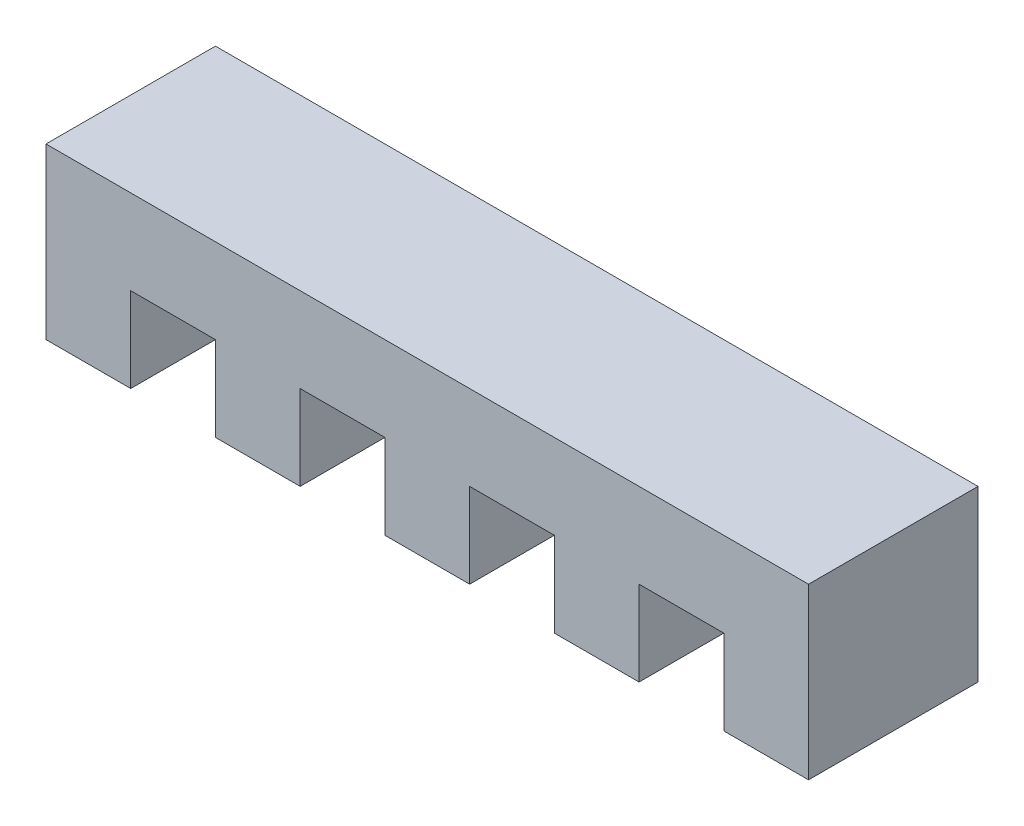
ISO-10303-21;
HEADER;
FILE_DESCRIPTION(('STEP AP214'),'2;1');
FILE_NAME('part.step','',(''),(''),'','','');
FILE_SCHEMA(('AUTOMOTIVE_DESIGN { 1 0 10303 214 1 1 1 1 }'));
ENDSEC;
DATA;
#1=APPLICATION_CONTEXT('core data for automotive mechanical design processes');
#2=APPLICATION_PROTOCOL_DEFINITION('international standard','automotive_design',2000,#1);
#3=PRODUCT_CONTEXT('',#1,'mechanical');
#4=PRODUCT('Part','Part','',(#3));
#5=PRODUCT_RELATED_PRODUCT_CATEGORY('part','',(#4));
#6=PRODUCT_DEFINITION_FORMATION('','',#4);
#7=PRODUCT_DEFINITION_CONTEXT('part definition',#1,'design');
#8=PRODUCT_DEFINITION('design','',#6,#7);
#9=PRODUCT_DEFINITION_SHAPE('','',#8);
#10=(LENGTH_UNIT() NAMED_UNIT(*) SI_UNIT(.MILLI.,.METRE.));
#11=(NAMED_UNIT(*) PLANE_ANGLE_UNIT() SI_UNIT($,.RADIAN.));
#12=(NAMED_UNIT(*) SI_UNIT($,.STERADIAN.) SOLID_ANGLE_UNIT());
#13=UNCERTAINTY_MEASURE_WITH_UNIT(LENGTH_MEASURE(1.E-05),#10,'distance_accuracy_value','');
#14=(GEOMETRIC_REPRESENTATION_CONTEXT(3) GLOBAL_UNCERTAINTY_ASSIGNED_CONTEXT((#13)) GLOBAL_UNIT_ASSIGNED_CONTEXT((#10,
#11,#12)) REPRESENTATION_CONTEXT('',''));
#15=CARTESIAN_POINT('',(0.,0.,0.));
#16=DIRECTION('',(0.,0.,1.));
#17=DIRECTION('',(1.,0.,0.));
#18=AXIS2_PLACEMENT_3D('',#15,#16,#17);
#19=CARTESIAN_POINT('',(-5.,10.,20.));
#20=DIRECTION('',(1.,0.,0.));
#21=DIRECTION('',(0.,1.,0.));
#22=AXIS2_PLACEMENT_3D('',#19,#20,#21);
#23=PLANE('',#22);
#24=DIRECTION('',(0.,-1.,0.));
#25=VECTOR('',#24,1.);
#26=CARTESIAN_POINT('',(-5.,10.,0.));
#27=LINE('',#26,#25);
#28=CARTESIAN_POINT('',(-5.,10.,0.));
#29=VERTEX_POINT('',#28);
#30=CARTESIAN_POINT('',(-5.,0.,0.));
#31=VERTEX_POINT('',#30);
#32=EDGE_CURVE('E200',#29,#31,#27,.T.);
#33=ORIENTED_EDGE('',*,*,#32,.T.);
#34=DIRECTION('',(0.,0.,-1.));
#35=VECTOR('',#34,1.);
#36=CARTESIAN_POINT('',(-5.,0.,20.));
#37=LINE('',#36,#35);
#38=CARTESIAN_POINT('',(-5.,0.,20.));
#39=VERTEX_POINT('',#38);
#40=EDGE_CURVE('E11',#39,#31,#37,.T.);
#41=ORIENTED_EDGE('',*,*,#40,.F.);
#42=DIRECTION('',(0.,-1.,0.));
#43=VECTOR('',#42,1.);
#44=CARTESIAN_POINT('',(-5.,10.,20.));
#45=LINE('',#44,#43);
#46=CARTESIAN_POINT('',(-5.,10.,20.));
#47=VERTEX_POINT('',#46);
#48=EDGE_CURVE('E238',#47,#39,#45,.T.);
#49=ORIENTED_EDGE('',*,*,#48,.F.);
#50=DIRECTION('',(0.,0.,-1.));
#51=VECTOR('',#50,1.);
#52=CARTESIAN_POINT('',(-5.,10.,20.));
#53=LINE('',#52,#51);
#54=EDGE_CURVE('E196',#47,#29,#53,.T.);
#55=ORIENTED_EDGE('',*,*,#54,.T.);
#56=EDGE_LOOP('',(#33,#41,#49,#55));
#57=FACE_BOUND('',#56,.T.);
#58=ADVANCED_FACE('F32',(#57),#23,.F.);
#59=CARTESIAN_POINT('',(-5.,0.,20.));
#60=DIRECTION('',(0.,1.,0.));
#61=DIRECTION('',(0.,0.,1.));
#62=AXIS2_PLACEMENT_3D('',#59,#60,#61);
#63=PLANE('',#62);
#64=DIRECTION('',(1.,0.,0.));
#65=VECTOR('',#64,1.);
#66=CARTESIAN_POINT('',(-5.,0.,0.));
#67=LINE('',#66,#65);
#68=CARTESIAN_POINT('',(5.,0.,0.));
#69=VERTEX_POINT('',#68);
#70=EDGE_CURVE('E203',#31,#69,#67,.T.);
#71=ORIENTED_EDGE('',*,*,#70,.T.);
#72=DIRECTION('',(0.,0.,-1.));
#73=VECTOR('',#72,1.);
#74=CARTESIAN_POINT('',(5.,0.,20.));
#75=LINE('',#74,#73);
#76=CARTESIAN_POINT('',(5.,0.,20.));
#77=VERTEX_POINT('',#76);
#78=EDGE_CURVE('E40',#77,#69,#75,.T.);
#79=ORIENTED_EDGE('',*,*,#78,.F.);
#80=DIRECTION('',(1.,0.,0.));
#81=VECTOR('',#80,1.);
#82=CARTESIAN_POINT('',(-5.,0.,20.));
#83=LINE('',#82,#81);
#84=EDGE_CURVE('E127',#39,#77,#83,.T.);
#85=ORIENTED_EDGE('',*,*,#84,.F.);
#86=ORIENTED_EDGE('',*,*,#40,.T.);
#87=EDGE_LOOP('',(#71,#79,#85,#86));
#88=FACE_BOUND('',#87,.T.);
#89=ADVANCED_FACE('F356',(#88),#63,.F.);
#90=CARTESIAN_POINT('',(5.,0.,20.));
#91=DIRECTION('',(-1.,0.,0.));
#92=DIRECTION('',(0.,-1.,0.));
#93=AXIS2_PLACEMENT_3D('',#90,#91,#92);
#94=PLANE('',#93);
#95=DIRECTION('',(0.,1.,0.));
#96=VECTOR('',#95,1.);
#97=CARTESIAN_POINT('',(5.,0.,0.));
#98=LINE('',#97,#96);
#99=CARTESIAN_POINT('',(5.,10.,0.));
#100=VERTEX_POINT('',#99);
#101=EDGE_CURVE('E205',#69,#100,#98,.T.);
#102=ORIENTED_EDGE('',*,*,#101,.T.);
#103=DIRECTION('',(0.,0.,-1.));
#104=VECTOR('',#103,1.);
#105=CARTESIAN_POINT('',(5.,10.,20.));
#106=LINE('',#105,#104);
#107=CARTESIAN_POINT('',(5.,10.,20.));
#108=VERTEX_POINT('',#107);
#109=EDGE_CURVE('E281',#108,#100,#106,.T.);
#110=ORIENTED_EDGE('',*,*,#109,.F.);
#111=DIRECTION('',(0.,1.,0.));
#112=VECTOR('',#111,1.);
#113=CARTESIAN_POINT('',(5.,0.,20.));
#114=LINE('',#113,#112);
#115=EDGE_CURVE('E289',#77,#108,#114,.T.);
#116=ORIENTED_EDGE('',*,*,#115,.F.);
#117=ORIENTED_EDGE('',*,*,#78,.T.);
#118=EDGE_LOOP('',(#102,#110,#116,#117));
#119=FACE_BOUND('',#118,.T.);
#120=ADVANCED_FACE('F287',(#119),#94,.F.);
#121=CARTESIAN_POINT('',(5.,10.,20.));
#122=DIRECTION('',(0.,1.,0.));
#123=DIRECTION('',(-1.,0.,0.));
#124=AXIS2_PLACEMENT_3D('',#121,#122,#123);
#125=PLANE('',#124);
#126=DIRECTION('',(1.,0.,0.));
#127=VECTOR('',#126,1.);
#128=CARTESIAN_POINT('',(5.,10.,0.));
#129=LINE('',#128,#127);
#130=CARTESIAN_POINT('',(15.,10.,0.));
#131=VERTEX_POINT('',#130);
#132=EDGE_CURVE('E207',#100,#131,#129,.T.);
#133=ORIENTED_EDGE('',*,*,#132,.T.);
#134=DIRECTION('',(0.,0.,-1.));
#135=VECTOR('',#134,1.);
#136=CARTESIAN_POINT('',(15.,10.,20.));
#137=LINE('',#136,#135);
#138=CARTESIAN_POINT('',(15.,10.,20.));
#139=VERTEX_POINT('',#138);
#140=EDGE_CURVE('E278',#139,#131,#137,.T.);
#141=ORIENTED_EDGE('',*,*,#140,.F.);
#142=DIRECTION('',(1.,0.,0.));
#143=VECTOR('',#142,1.);
#144=CARTESIAN_POINT('',(5.,10.,20.));
#145=LINE('',#144,#143);
#146=EDGE_CURVE('E307',#108,#139,#145,.T.);
#147=ORIENTED_EDGE('',*,*,#146,.F.);
#148=ORIENTED_EDGE('',*,*,#109,.T.);
#149=EDGE_LOOP('',(#133,#141,#147,#148));
#150=FACE_BOUND('',#149,.T.);
#151=ADVANCED_FACE('F298',(#150),#125,.F.);
#152=CARTESIAN_POINT('',(15.,10.,20.));
#153=DIRECTION('',(1.,0.,0.));
#154=DIRECTION('',(0.,0.,-1.));
#155=AXIS2_PLACEMENT_3D('',#152,#153,#154);
#156=PLANE('',#155);
#157=DIRECTION('',(0.,-1.,0.));
#158=VECTOR('',#157,1.);
#159=CARTESIAN_POINT('',(15.,10.,0.));
#160=LINE('',#159,#158);
#161=CARTESIAN_POINT('',(15.,0.,0.));
#162=VERTEX_POINT('',#161);
#163=EDGE_CURVE('E209',#131,#162,#160,.T.);
#164=ORIENTED_EDGE('',*,*,#163,.T.);
#165=DIRECTION('',(0.,0.,-1.));
#166=VECTOR('',#165,1.);
#167=CARTESIAN_POINT('',(15.,0.,20.));
#168=LINE('',#167,#166);
#169=CARTESIAN_POINT('',(15.,0.,20.));
#170=VERTEX_POINT('',#169);
#171=EDGE_CURVE('E275',#170,#162,#168,.T.);
#172=ORIENTED_EDGE('',*,*,#171,.F.);
#173=DIRECTION('',(0.,-1.,0.));
#174=VECTOR('',#173,1.);
#175=CARTESIAN_POINT('',(15.,10.,20.));
#176=LINE('',#175,#174);
#177=EDGE_CURVE('E304',#139,#170,#176,.T.);
#178=ORIENTED_EDGE('',*,*,#177,.F.);
#179=ORIENTED_EDGE('',*,*,#140,.T.);
#180=EDGE_LOOP('',(#164,#172,#178,#179));
#181=FACE_BOUND('',#180,.T.);
#182=ADVANCED_FACE('F302',(#181),#156,.F.);
#183=CARTESIAN_POINT('',(15.,0.,20.));
#184=DIRECTION('',(0.,1.,0.));
#185=DIRECTION('',(-1.,0.,0.));
#186=AXIS2_PLACEMENT_3D('',#183,#184,#185);
#187=PLANE('',#186);
#188=DIRECTION('',(1.,0.,0.));
#189=VECTOR('',#188,1.);
#190=CARTESIAN_POINT('',(15.,0.,0.));
#191=LINE('',#190,#189);
#192=CARTESIAN_POINT('',(25.,0.,0.));
#193=VERTEX_POINT('',#192);
#194=EDGE_CURVE('E211',#162,#193,#191,.T.);
#195=ORIENTED_EDGE('',*,*,#194,.T.);
#196=DIRECTION('',(0.,0.,-1.));
#197=VECTOR('',#196,1.);
#198=CARTESIAN_POINT('',(25.,0.,20.));
#199=LINE('',#198,#197);
#200=CARTESIAN_POINT('',(25.,0.,20.));
#201=VERTEX_POINT('',#200);
#202=EDGE_CURVE('E272',#201,#193,#199,.T.);
#203=ORIENTED_EDGE('',*,*,#202,.F.);
#204=DIRECTION('',(1.,0.,0.));
#205=VECTOR('',#204,1.);
#206=CARTESIAN_POINT('',(15.,0.,20.));
#207=LINE('',#206,#205);
#208=EDGE_CURVE('E306',#170,#201,#207,.T.);
#209=ORIENTED_EDGE('',*,*,#208,.F.);
#210=ORIENTED_EDGE('',*,*,#171,.T.);
#211=EDGE_LOOP('',(#195,#203,#209,#210));
#212=FACE_BOUND('',#211,.T.);
#213=ADVANCED_FACE('F369',(#212),#187,.F.);
#214=CARTESIAN_POINT('',(25.,0.,20.));
#215=DIRECTION('',(-1.,0.,0.));
#216=DIRECTION('',(0.,0.,1.));
#217=AXIS2_PLACEMENT_3D('',#214,#215,#216);
#218=PLANE('',#217);
#219=DIRECTION('',(0.,1.,0.));
#220=VECTOR('',#219,1.);
#221=CARTESIAN_POINT('',(25.,0.,0.));
#222=LINE('',#221,#220);
#223=CARTESIAN_POINT('',(25.,10.,0.));
#224=VERTEX_POINT('',#223);
#225=EDGE_CURVE('E213',#193,#224,#222,.T.);
#226=ORIENTED_EDGE('',*,*,#225,.T.);
#227=DIRECTION('',(0.,0.,-1.));
#228=VECTOR('',#227,1.);
#229=CARTESIAN_POINT('',(25.,10.,20.));
#230=LINE('',#229,#228);
#231=CARTESIAN_POINT('',(25.,10.,20.));
#232=VERTEX_POINT('',#231);
#233=EDGE_CURVE('E269',#232,#224,#230,.T.);
#234=ORIENTED_EDGE('',*,*,#233,.F.);
#235=DIRECTION('',(0.,1.,0.));
#236=VECTOR('',#235,1.);
#237=CARTESIAN_POINT('',(25.,0.,20.));
#238=LINE('',#237,#236);
#239=EDGE_CURVE('E309',#201,#232,#238,.T.);
#240=ORIENTED_EDGE('',*,*,#239,.F.);
#241=ORIENTED_EDGE('',*,*,#202,.T.);
#242=EDGE_LOOP('',(#226,#234,#240,#241));
#243=FACE_BOUND('',#242,.T.);
#244=ADVANCED_FACE('F372',(#243),#218,.F.);
#245=CARTESIAN_POINT('',(25.,10.,20.));
#246=DIRECTION('',(0.,1.,0.));
#247=DIRECTION('',(-1.,0.,0.));
#248=AXIS2_PLACEMENT_3D('',#245,#246,#247);
#249=PLANE('',#248);
#250=DIRECTION('',(1.,0.,0.));
#251=VECTOR('',#250,1.);
#252=CARTESIAN_POINT('',(25.,10.,0.));
#253=LINE('',#252,#251);
#254=CARTESIAN_POINT('',(35.,10.,0.));
#255=VERTEX_POINT('',#254);
#256=EDGE_CURVE('E215',#224,#255,#253,.T.);
#257=ORIENTED_EDGE('',*,*,#256,.T.);
#258=DIRECTION('',(0.,0.,-1.));
#259=VECTOR('',#258,1.);
#260=CARTESIAN_POINT('',(35.,10.,20.));
#261=LINE('',#260,#259);
#262=CARTESIAN_POINT('',(35.,10.,20.));
#263=VERTEX_POINT('',#262);
#264=EDGE_CURVE('E266',#263,#255,#261,.T.);
#265=ORIENTED_EDGE('',*,*,#264,.F.);
#266=DIRECTION('',(1.,0.,0.));
#267=VECTOR('',#266,1.);
#268=CARTESIAN_POINT('',(25.,10.,20.));
#269=LINE('',#268,#267);
#270=EDGE_CURVE('E315',#232,#263,#269,.T.);
#271=ORIENTED_EDGE('',*,*,#270,.F.);
#272=ORIENTED_EDGE('',*,*,#233,.T.);
#273=EDGE_LOOP('',(#257,#265,#271,#272));
#274=FACE_BOUND('',#273,.T.);
#275=ADVANCED_FACE('F376',(#274),#249,.F.);
#276=CARTESIAN_POINT('',(35.,10.,20.));
#277=DIRECTION('',(1.,0.,0.));
#278=DIRECTION('',(0.,0.,-1.));
#279=AXIS2_PLACEMENT_3D('',#276,#277,#278);
#280=PLANE('',#279);
#281=DIRECTION('',(0.,-1.,0.));
#282=VECTOR('',#281,1.);
#283=CARTESIAN_POINT('',(35.,10.,0.));
#284=LINE('',#283,#282);
#285=CARTESIAN_POINT('',(35.,0.,0.));
#286=VERTEX_POINT('',#285);
#287=EDGE_CURVE('E217',#255,#286,#284,.T.);
#288=ORIENTED_EDGE('',*,*,#287,.T.);
#289=DIRECTION('',(0.,0.,-1.));
#290=VECTOR('',#289,1.);
#291=CARTESIAN_POINT('',(35.,0.,20.));
#292=LINE('',#291,#290);
#293=CARTESIAN_POINT('',(35.,0.,20.));
#294=VERTEX_POINT('',#293);
#295=EDGE_CURVE('E263',#294,#286,#292,.T.);
#296=ORIENTED_EDGE('',*,*,#295,.F.);
#297=DIRECTION('',(0.,-1.,0.));
#298=VECTOR('',#297,1.);
#299=CARTESIAN_POINT('',(35.,10.,20.));
#300=LINE('',#299,#298);
#301=EDGE_CURVE('E317',#263,#294,#300,.T.);
#302=ORIENTED_EDGE('',*,*,#301,.F.);
#303=ORIENTED_EDGE('',*,*,#264,.T.);
#304=EDGE_LOOP('',(#288,#296,#302,#303));
#305=FACE_BOUND('',#304,.T.);
#306=ADVANCED_FACE('F380',(#305),#280,.F.);
#307=CARTESIAN_POINT('',(35.,0.,20.));
#308=DIRECTION('',(0.,1.,0.));
#309=DIRECTION('',(0.,0.,1.));
#310=AXIS2_PLACEMENT_3D('',#307,#308,#309);
#311=PLANE('',#310);
#312=DIRECTION('',(1.,0.,0.));
#313=VECTOR('',#312,1.);
#314=CARTESIAN_POINT('',(35.,0.,0.));
#315=LINE('',#314,#313);
#316=CARTESIAN_POINT('',(45.,0.,0.));
#317=VERTEX_POINT('',#316);
#318=EDGE_CURVE('E219',#286,#317,#315,.T.);
#319=ORIENTED_EDGE('',*,*,#318,.T.);
#320=DIRECTION('',(0.,0.,-1.));
#321=VECTOR('',#320,1.);
#322=CARTESIAN_POINT('',(45.,0.,20.));
#323=LINE('',#322,#321);
#324=CARTESIAN_POINT('',(45.,0.,20.));
#325=VERTEX_POINT('',#324);
#326=EDGE_CURVE('E260',#325,#317,#323,.T.);
#327=ORIENTED_EDGE('',*,*,#326,.F.);
#328=DIRECTION('',(1.,0.,0.));
#329=VECTOR('',#328,1.);
#330=CARTESIAN_POINT('',(35.,0.,20.));
#331=LINE('',#330,#329);
#332=EDGE_CURVE('E319',#294,#325,#331,.T.);
#333=ORIENTED_EDGE('',*,*,#332,.F.);
#334=ORIENTED_EDGE('',*,*,#295,.T.);
#335=EDGE_LOOP('',(#319,#327,#333,#334));
#336=FACE_BOUND('',#335,.T.);
#337=ADVANCED_FACE('F384',(#336),#311,.F.);
#338=CARTESIAN_POINT('',(45.,0.,20.));
#339=DIRECTION('',(-1.,0.,0.));
#340=DIRECTION('',(0.,0.,1.));
#341=AXIS2_PLACEMENT_3D('',#338,#339,#340);
#342=PLANE('',#341);
#343=DIRECTION('',(0.,1.,0.));
#344=VECTOR('',#343,1.);
#345=CARTESIAN_POINT('',(45.,0.,0.));
#346=LINE('',#345,#344);
#347=CARTESIAN_POINT('',(45.,20.,0.));
#348=VERTEX_POINT('',#347);
#349=EDGE_CURVE('E221',#317,#348,#346,.T.);
#350=ORIENTED_EDGE('',*,*,#349,.T.);
#351=DIRECTION('',(0.,0.,-1.));
#352=VECTOR('',#351,1.);
#353=CARTESIAN_POINT('',(45.,20.,20.));
#354=LINE('',#353,#352);
#355=CARTESIAN_POINT('',(45.,20.,20.));
#356=VERTEX_POINT('',#355);
#357=EDGE_CURVE('E257',#356,#348,#354,.T.);
#358=ORIENTED_EDGE('',*,*,#357,.F.);
#359=DIRECTION('',(0.,1.,0.));
#360=VECTOR('',#359,1.);
#361=CARTESIAN_POINT('',(45.,0.,20.));
#362=LINE('',#361,#360);
#363=EDGE_CURVE('E321',#325,#356,#362,.T.);
#364=ORIENTED_EDGE('',*,*,#363,.F.);
#365=ORIENTED_EDGE('',*,*,#326,.T.);
#366=EDGE_LOOP('',(#350,#358,#364,#365));
#367=FACE_BOUND('',#366,.T.);
#368=ADVANCED_FACE('F388',(#367),#342,.F.);
#369=CARTESIAN_POINT('',(45.,20.,20.));
#370=DIRECTION('',(0.,-1.,0.));
#371=DIRECTION('',(0.,0.,-1.));
#372=AXIS2_PLACEMENT_3D('',#369,#370,#371);
#373=PLANE('',#372);
#374=DIRECTION('',(-1.,0.,0.));
#375=VECTOR('',#374,1.);
#376=CARTESIAN_POINT('',(45.,20.,0.));
#377=LINE('',#376,#375);
#378=CARTESIAN_POINT('',(-45.,20.,0.));
#379=VERTEX_POINT('',#378);
#380=EDGE_CURVE('E223',#348,#379,#377,.T.);
#381=ORIENTED_EDGE('',*,*,#380,.T.);
#382=DIRECTION('',(0.,0.,-1.));
#383=VECTOR('',#382,1.);
#384=CARTESIAN_POINT('',(-45.,20.,20.));
#385=LINE('',#384,#383);
#386=CARTESIAN_POINT('',(-45.,20.,20.));
#387=VERTEX_POINT('',#386);
#388=EDGE_CURVE('E254',#387,#379,#385,.T.);
#389=ORIENTED_EDGE('',*,*,#388,.F.);
#390=DIRECTION('',(-1.,0.,0.));
#391=VECTOR('',#390,1.);
#392=CARTESIAN_POINT('',(45.,20.,20.));
#393=LINE('',#392,#391);
#394=EDGE_CURVE('E323',#356,#387,#393,.T.);
#395=ORIENTED_EDGE('',*,*,#394,.F.);
#396=ORIENTED_EDGE('',*,*,#357,.T.);
#397=EDGE_LOOP('',(#381,#389,#395,#396));
#398=FACE_BOUND('',#397,.T.);
#399=ADVANCED_FACE('F392',(#398),#373,.F.);
#400=CARTESIAN_POINT('',(-45.,20.,20.));
#401=DIRECTION('',(1.,0.,0.));
#402=DIRECTION('',(0.,0.,-1.));
#403=AXIS2_PLACEMENT_3D('',#400,#401,#402);
#404=PLANE('',#403);
#405=DIRECTION('',(0.,-1.,0.));
#406=VECTOR('',#405,1.);
#407=CARTESIAN_POINT('',(-45.,20.,0.));
#408=LINE('',#407,#406);
#409=CARTESIAN_POINT('',(-45.,0.,0.));
#410=VERTEX_POINT('',#409);
#411=EDGE_CURVE('E225',#379,#410,#408,.T.);
#412=ORIENTED_EDGE('',*,*,#411,.T.);
#413=DIRECTION('',(0.,0.,-1.));
#414=VECTOR('',#413,1.);
#415=CARTESIAN_POINT('',(-45.,0.,20.));
#416=LINE('',#415,#414);
#417=CARTESIAN_POINT('',(-45.,0.,20.));
#418=VERTEX_POINT('',#417);
#419=EDGE_CURVE('E251',#418,#410,#416,.T.);
#420=ORIENTED_EDGE('',*,*,#419,.F.);
#421=DIRECTION('',(0.,-1.,0.));
#422=VECTOR('',#421,1.);
#423=CARTESIAN_POINT('',(-45.,20.,20.));
#424=LINE('',#423,#422);
#425=EDGE_CURVE('E325',#387,#418,#424,.T.);
#426=ORIENTED_EDGE('',*,*,#425,.F.);
#427=ORIENTED_EDGE('',*,*,#388,.T.);
#428=EDGE_LOOP('',(#412,#420,#426,#427));
#429=FACE_BOUND('',#428,.T.);
#430=ADVANCED_FACE('F396',(#429),#404,.F.);
#431=CARTESIAN_POINT('',(-45.,0.,20.));
#432=DIRECTION('',(0.,1.,0.));
#433=DIRECTION('',(0.,0.,1.));
#434=AXIS2_PLACEMENT_3D('',#431,#432,#433);
#435=PLANE('',#434);
#436=DIRECTION('',(1.,0.,0.));
#437=VECTOR('',#436,1.);
#438=CARTESIAN_POINT('',(-45.,0.,0.));
#439=LINE('',#438,#437);
#440=CARTESIAN_POINT('',(-35.,0.,0.));
#441=VERTEX_POINT('',#440);
#442=EDGE_CURVE('E227',#410,#441,#439,.T.);
#443=ORIENTED_EDGE('',*,*,#442,.T.);
#444=DIRECTION('',(0.,0.,-1.));
#445=VECTOR('',#444,1.);
#446=CARTESIAN_POINT('',(-35.,0.,20.));
#447=LINE('',#446,#445);
#448=CARTESIAN_POINT('',(-35.,0.,20.));
#449=VERTEX_POINT('',#448);
#450=EDGE_CURVE('E248',#449,#441,#447,.T.);
#451=ORIENTED_EDGE('',*,*,#450,.F.);
#452=DIRECTION('',(1.,0.,0.));
#453=VECTOR('',#452,1.);
#454=CARTESIAN_POINT('',(-45.,0.,20.));
#455=LINE('',#454,#453);
#456=EDGE_CURVE('E327',#418,#449,#455,.T.);
#457=ORIENTED_EDGE('',*,*,#456,.F.);
#458=ORIENTED_EDGE('',*,*,#419,.T.);
#459=EDGE_LOOP('',(#443,#451,#457,#458));
#460=FACE_BOUND('',#459,.T.);
#461=ADVANCED_FACE('F400',(#460),#435,.F.);
#462=CARTESIAN_POINT('',(-35.,0.,20.));
#463=DIRECTION('',(-1.,0.,0.));
#464=DIRECTION('',(0.,0.,1.));
#465=AXIS2_PLACEMENT_3D('',#462,#463,#464);
#466=PLANE('',#465);
#467=DIRECTION('',(0.,1.,0.));
#468=VECTOR('',#467,1.);
#469=CARTESIAN_POINT('',(-35.,0.,0.));
#470=LINE('',#469,#468);
#471=CARTESIAN_POINT('',(-35.,10.,0.));
#472=VERTEX_POINT('',#471);
#473=EDGE_CURVE('E229',#441,#472,#470,.T.);
#474=ORIENTED_EDGE('',*,*,#473,.T.);
#475=DIRECTION('',(0.,0.,-1.));
#476=VECTOR('',#475,1.);
#477=CARTESIAN_POINT('',(-35.,10.,20.));
#478=LINE('',#477,#476);
#479=CARTESIAN_POINT('',(-35.,10.,20.));
#480=VERTEX_POINT('',#479);
#481=EDGE_CURVE('E245',#480,#472,#478,.T.);
#482=ORIENTED_EDGE('',*,*,#481,.F.);
#483=DIRECTION('',(0.,1.,0.));
#484=VECTOR('',#483,1.);
#485=CARTESIAN_POINT('',(-35.,0.,20.));
#486=LINE('',#485,#484);
#487=EDGE_CURVE('E329',#449,#480,#486,.T.);
#488=ORIENTED_EDGE('',*,*,#487,.F.);
#489=ORIENTED_EDGE('',*,*,#450,.T.);
#490=EDGE_LOOP('',(#474,#482,#488,#489));
#491=FACE_BOUND('',#490,.T.);
#492=ADVANCED_FACE('F404',(#491),#466,.F.);
#493=CARTESIAN_POINT('',(-35.,10.,20.));
#494=DIRECTION('',(0.,1.,0.));
#495=DIRECTION('',(-1.,0.,0.));
#496=AXIS2_PLACEMENT_3D('',#493,#494,#495);
#497=PLANE('',#496);
#498=DIRECTION('',(1.,0.,0.));
#499=VECTOR('',#498,1.);
#500=CARTESIAN_POINT('',(-35.,10.,0.));
#501=LINE('',#500,#499);
#502=CARTESIAN_POINT('',(-25.,10.,0.));
#503=VERTEX_POINT('',#502);
#504=EDGE_CURVE('E231',#472,#503,#501,.T.);
#505=ORIENTED_EDGE('',*,*,#504,.T.);
#506=DIRECTION('',(0.,0.,-1.));
#507=VECTOR('',#506,1.);
#508=CARTESIAN_POINT('',(-25.,10.,20.));
#509=LINE('',#508,#507);
#510=CARTESIAN_POINT('',(-25.,10.,20.));
#511=VERTEX_POINT('',#510);
#512=EDGE_CURVE('E242',#511,#503,#509,.T.);
#513=ORIENTED_EDGE('',*,*,#512,.F.);
#514=DIRECTION('',(1.,0.,0.));
#515=VECTOR('',#514,1.);
#516=CARTESIAN_POINT('',(-35.,10.,20.));
#517=LINE('',#516,#515);
#518=EDGE_CURVE('E331',#480,#511,#517,.T.);
#519=ORIENTED_EDGE('',*,*,#518,.F.);
#520=ORIENTED_EDGE('',*,*,#481,.T.);
#521=EDGE_LOOP('',(#505,#513,#519,#520));
#522=FACE_BOUND('',#521,.T.);
#523=ADVANCED_FACE('F337',(#522),#497,.F.);
#524=CARTESIAN_POINT('',(-25.,10.,20.));
#525=DIRECTION('',(1.,0.,0.));
#526=DIRECTION('',(0.,0.,-1.));
#527=AXIS2_PLACEMENT_3D('',#524,#525,#526);
#528=PLANE('',#527);
#529=DIRECTION('',(0.,-1.,0.));
#530=VECTOR('',#529,1.);
#531=CARTESIAN_POINT('',(-25.,10.,0.));
#532=LINE('',#531,#530);
#533=CARTESIAN_POINT('',(-25.,0.,0.));
#534=VERTEX_POINT('',#533);
#535=EDGE_CURVE('E233',#503,#534,#532,.T.);
#536=ORIENTED_EDGE('',*,*,#535,.T.);
#537=DIRECTION('',(0.,0.,-1.));
#538=VECTOR('',#537,1.);
#539=CARTESIAN_POINT('',(-25.,0.,20.));
#540=LINE('',#539,#538);
#541=CARTESIAN_POINT('',(-25.,0.,20.));
#542=VERTEX_POINT('',#541);
#543=EDGE_CURVE('E191',#542,#534,#540,.T.);
#544=ORIENTED_EDGE('',*,*,#543,.F.);
#545=DIRECTION('',(0.,-1.,0.));
#546=VECTOR('',#545,1.);
#547=CARTESIAN_POINT('',(-25.,10.,20.));
#548=LINE('',#547,#546);
#549=EDGE_CURVE('E182',#511,#542,#548,.T.);
#550=ORIENTED_EDGE('',*,*,#549,.F.);
#551=ORIENTED_EDGE('',*,*,#512,.T.);
#552=EDGE_LOOP('',(#536,#544,#550,#551));
#553=FACE_BOUND('',#552,.T.);
#554=ADVANCED_FACE('F341',(#553),#528,.F.);
#555=CARTESIAN_POINT('',(-25.,0.,20.));
#556=DIRECTION('',(0.,1.,0.));
#557=DIRECTION('',(-1.,0.,0.));
#558=AXIS2_PLACEMENT_3D('',#555,#556,#557);
#559=PLANE('',#558);
#560=DIRECTION('',(1.,0.,0.));
#561=VECTOR('',#560,1.);
#562=CARTESIAN_POINT('',(-25.,0.,0.));
#563=LINE('',#562,#561);
#564=CARTESIAN_POINT('',(-15.,0.,0.));
#565=VERTEX_POINT('',#564);
#566=EDGE_CURVE('E190',#534,#565,#563,.T.);
#567=ORIENTED_EDGE('',*,*,#566,.T.);
#568=DIRECTION('',(0.,0.,-1.));
#569=VECTOR('',#568,1.);
#570=CARTESIAN_POINT('',(-15.,0.,20.));
#571=LINE('',#570,#569);
#572=CARTESIAN_POINT('',(-15.,0.,20.));
#573=VERTEX_POINT('',#572);
#574=EDGE_CURVE('E187',#573,#565,#571,.T.);
#575=ORIENTED_EDGE('',*,*,#574,.F.);
#576=DIRECTION('',(1.,0.,0.));
#577=VECTOR('',#576,1.);
#578=CARTESIAN_POINT('',(-25.,0.,20.));
#579=LINE('',#578,#577);
#580=EDGE_CURVE('E176',#542,#573,#579,.T.);
#581=ORIENTED_EDGE('',*,*,#580,.F.);
#582=ORIENTED_EDGE('',*,*,#543,.T.);
#583=EDGE_LOOP('',(#567,#575,#581,#582));
#584=FACE_BOUND('',#583,.T.);
#585=ADVANCED_FACE('F188',(#584),#559,.F.);
#586=CARTESIAN_POINT('',(-15.,0.,20.));
#587=DIRECTION('',(-1.,0.,0.));
#588=DIRECTION('',(0.,0.,1.));
#589=AXIS2_PLACEMENT_3D('',#586,#587,#588);
#590=PLANE('',#589);
#591=DIRECTION('',(0.,1.,0.));
#592=VECTOR('',#591,1.);
#593=CARTESIAN_POINT('',(-15.,0.,0.));
#594=LINE('',#593,#592);
#595=CARTESIAN_POINT('',(-15.,10.,0.));
#596=VERTEX_POINT('',#595);
#597=EDGE_CURVE('E113',#565,#596,#594,.T.);
#598=ORIENTED_EDGE('',*,*,#597,.T.);
#599=DIRECTION('',(0.,0.,-1.));
#600=VECTOR('',#599,1.);
#601=CARTESIAN_POINT('',(-15.,10.,20.));
#602=LINE('',#601,#600);
#603=CARTESIAN_POINT('',(-15.,10.,20.));
#604=VERTEX_POINT('',#603);
#605=EDGE_CURVE('E192',#604,#596,#602,.T.);
#606=ORIENTED_EDGE('',*,*,#605,.F.);
#607=DIRECTION('',(0.,1.,0.));
#608=VECTOR('',#607,1.);
#609=CARTESIAN_POINT('',(-15.,0.,20.));
#610=LINE('',#609,#608);
#611=EDGE_CURVE('E180',#573,#604,#610,.T.);
#612=ORIENTED_EDGE('',*,*,#611,.F.);
#613=ORIENTED_EDGE('',*,*,#574,.T.);
#614=EDGE_LOOP('',(#598,#606,#612,#613));
#615=FACE_BOUND('',#614,.T.);
#616=ADVANCED_FACE('F194',(#615),#590,.F.);
#617=CARTESIAN_POINT('',(-15.,10.,20.));
#618=DIRECTION('',(0.,1.,0.));
#619=DIRECTION('',(-1.,0.,0.));
#620=AXIS2_PLACEMENT_3D('',#617,#618,#619);
#621=PLANE('',#620);
#622=DIRECTION('',(1.,0.,0.));
#623=VECTOR('',#622,1.);
#624=CARTESIAN_POINT('',(-15.,10.,0.));
#625=LINE('',#624,#623);
#626=EDGE_CURVE('E119',#596,#29,#625,.T.);
#627=ORIENTED_EDGE('',*,*,#626,.T.);
#628=ORIENTED_EDGE('',*,*,#54,.F.);
#629=DIRECTION('',(1.,0.,0.));
#630=VECTOR('',#629,1.);
#631=CARTESIAN_POINT('',(-15.,10.,20.));
#632=LINE('',#631,#630);
#633=EDGE_CURVE('E48',#604,#47,#632,.T.);
#634=ORIENTED_EDGE('',*,*,#633,.F.);
#635=ORIENTED_EDGE('',*,*,#605,.T.);
#636=EDGE_LOOP('',(#627,#628,#634,#635));
#637=FACE_BOUND('',#636,.T.);
#638=ADVANCED_FACE('F345',(#637),#621,.F.);
#639=CARTESIAN_POINT('',(0.,0.,20.));
#640=DIRECTION('',(0.,0.,1.));
#641=DIRECTION('',(1.,0.,0.));
#642=AXIS2_PLACEMENT_3D('',#639,#640,#641);
#643=PLANE('',#642);
#644=ORIENTED_EDGE('',*,*,#48,.T.);
#645=ORIENTED_EDGE('',*,*,#84,.T.);
#646=ORIENTED_EDGE('',*,*,#115,.T.);
#647=ORIENTED_EDGE('',*,*,#146,.T.);
#648=ORIENTED_EDGE('',*,*,#177,.T.);
#649=ORIENTED_EDGE('',*,*,#208,.T.);
#650=ORIENTED_EDGE('',*,*,#239,.T.);
#651=ORIENTED_EDGE('',*,*,#270,.T.);
#652=ORIENTED_EDGE('',*,*,#301,.T.);
#653=ORIENTED_EDGE('',*,*,#332,.T.);
#654=ORIENTED_EDGE('',*,*,#363,.T.);
#655=ORIENTED_EDGE('',*,*,#394,.T.);
#656=ORIENTED_EDGE('',*,*,#425,.T.);
#657=ORIENTED_EDGE('',*,*,#456,.T.);
#658=ORIENTED_EDGE('',*,*,#487,.T.);
#659=ORIENTED_EDGE('',*,*,#518,.T.);
#660=ORIENTED_EDGE('',*,*,#549,.T.);
#661=ORIENTED_EDGE('',*,*,#580,.T.);
#662=ORIENTED_EDGE('',*,*,#611,.T.);
#663=ORIENTED_EDGE('',*,*,#633,.T.);
#664=EDGE_LOOP('',(#644,#645,#646,#647,#648,#649,#650,#651,#652,#653,#654,#655,#656,#657,#658,
#659,#660,#661,#662,#663));
#665=FACE_BOUND('',#664,.T.);
#666=ADVANCED_FACE('F178',(#665),#643,.T.);
#667=CARTESIAN_POINT('',(0.,0.,0.));
#668=DIRECTION('',(0.,0.,1.));
#669=DIRECTION('',(1.,0.,0.));
#670=AXIS2_PLACEMENT_3D('',#667,#668,#669);
#671=PLANE('',#670);
#672=ORIENTED_EDGE('',*,*,#32,.F.);
#673=ORIENTED_EDGE('',*,*,#626,.F.);
#674=ORIENTED_EDGE('',*,*,#597,.F.);
#675=ORIENTED_EDGE('',*,*,#566,.F.);
#676=ORIENTED_EDGE('',*,*,#535,.F.);
#677=ORIENTED_EDGE('',*,*,#504,.F.);
#678=ORIENTED_EDGE('',*,*,#473,.F.);
#679=ORIENTED_EDGE('',*,*,#442,.F.);
#680=ORIENTED_EDGE('',*,*,#411,.F.);
#681=ORIENTED_EDGE('',*,*,#380,.F.);
#682=ORIENTED_EDGE('',*,*,#349,.F.);
#683=ORIENTED_EDGE('',*,*,#318,.F.);
#684=ORIENTED_EDGE('',*,*,#287,.F.);
#685=ORIENTED_EDGE('',*,*,#256,.F.);
#686=ORIENTED_EDGE('',*,*,#225,.F.);
#687=ORIENTED_EDGE('',*,*,#194,.F.);
#688=ORIENTED_EDGE('',*,*,#163,.F.);
#689=ORIENTED_EDGE('',*,*,#132,.F.);
#690=ORIENTED_EDGE('',*,*,#101,.F.);
#691=ORIENTED_EDGE('',*,*,#70,.F.);
#692=EDGE_LOOP('',(#672,#673,#674,#675,#676,#677,#678,#679,#680,#681,#682,#683,#684,#685,#686,
#687,#688,#689,#690,#691));
#693=FACE_BOUND('',#692,.T.);
#694=ADVANCED_FACE('F293',(#693),#671,.F.);
#695=CLOSED_SHELL('',(#58,#89,#120,#151,#182,#213,#244,#275,#306,#337,#368,#399,#430,#461,#492,
#523,#554,#585,#616,#638,#666,#694));
#696=MANIFOLD_SOLID_BREP('B2',#695);
#697=ADVANCED_BREP_SHAPE_REPRESENTATION('',(#18,#696),#14);
#698=SHAPE_DEFINITION_REPRESENTATION(#9,#697);
ENDSEC;
END-ISO-10303-21;
